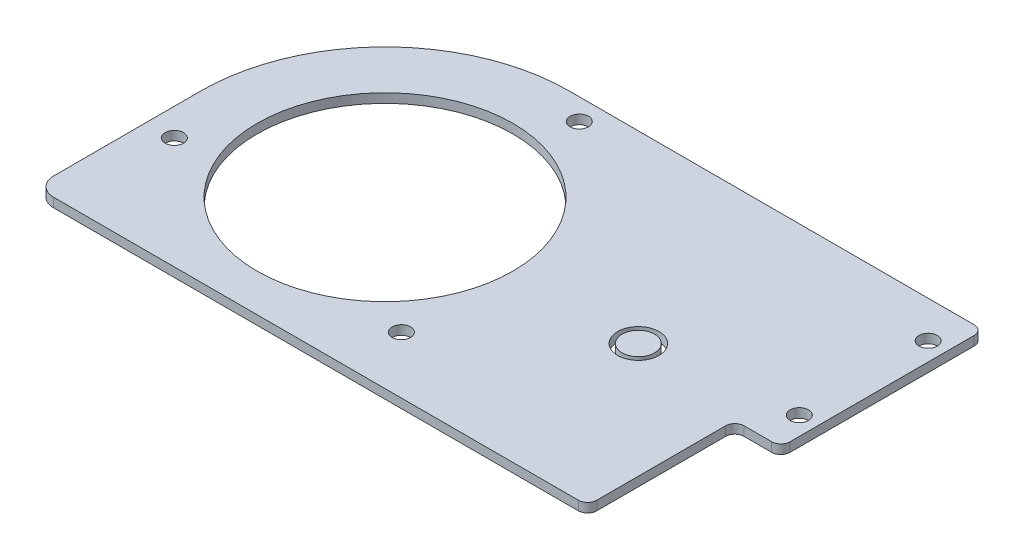
ISO-10303-21;
HEADER;
FILE_DESCRIPTION(('STEP AP214'),'2;1');
FILE_NAME('part.step','',(''),(''),'','','');
FILE_SCHEMA(('AUTOMOTIVE_DESIGN { 1 0 10303 214 1 1 1 1 }'));
ENDSEC;
DATA;
#1=APPLICATION_CONTEXT('core data for automotive mechanical design processes');
#2=APPLICATION_PROTOCOL_DEFINITION('international standard','automotive_design',2000,#1);
#3=PRODUCT_CONTEXT('',#1,'mechanical');
#4=PRODUCT('Part','Part','',(#3));
#5=PRODUCT_RELATED_PRODUCT_CATEGORY('part','',(#4));
#6=PRODUCT_DEFINITION_FORMATION('','',#4);
#7=PRODUCT_DEFINITION_CONTEXT('part definition',#1,'design');
#8=PRODUCT_DEFINITION('design','',#6,#7);
#9=PRODUCT_DEFINITION_SHAPE('','',#8);
#10=(LENGTH_UNIT() NAMED_UNIT(*) SI_UNIT(.MILLI.,.METRE.));
#11=(NAMED_UNIT(*) PLANE_ANGLE_UNIT() SI_UNIT($,.RADIAN.));
#12=(NAMED_UNIT(*) SI_UNIT($,.STERADIAN.) SOLID_ANGLE_UNIT());
#13=UNCERTAINTY_MEASURE_WITH_UNIT(LENGTH_MEASURE(1.E-05),#10,'distance_accuracy_value','');
#14=(GEOMETRIC_REPRESENTATION_CONTEXT(3) GLOBAL_UNCERTAINTY_ASSIGNED_CONTEXT((#13)) GLOBAL_UNIT_ASSIGNED_CONTEXT((#10,
#11,#12)) REPRESENTATION_CONTEXT('',''));
#15=CARTESIAN_POINT('',(0.,0.,0.));
#16=DIRECTION('',(0.,0.,1.));
#17=DIRECTION('',(1.,0.,0.));
#18=AXIS2_PLACEMENT_3D('',#15,#16,#17);
#19=CARTESIAN_POINT('',(-114.3,6.35,101.6));
#20=DIRECTION('',(0.,-1.,0.));
#21=DIRECTION('',(0.,0.,-1.));
#22=AXIS2_PLACEMENT_3D('',#19,#20,#21);
#23=PLANE('',#22);
#24=CARTESIAN_POINT('',(21.8094681715398,6.35,-112.199987068068));
#25=DIRECTION('',(0.,1.,0.));
#26=DIRECTION('',(0.,0.,1.));
#27=AXIS2_PLACEMENT_3D('',#24,#25,#26);
#28=CIRCLE('',#27,6.34999999999998);
#29=CARTESIAN_POINT('',(21.8094681715398,6.35,-105.849987068068));
#30=VERTEX_POINT('',#29);
#31=EDGE_CURVE('E195',#30,#30,#28,.T.);
#32=ORIENTED_EDGE('',*,*,#31,.F.);
#33=EDGE_LOOP('',(#32));
#34=FACE_BOUND('',#33,.T.);
#35=CARTESIAN_POINT('',(273.05,6.35,-101.6));
#36=DIRECTION('',(0.,1.,0.));
#37=DIRECTION('',(0.,0.,1.));
#38=AXIS2_PLACEMENT_3D('',#35,#36,#37);
#39=CIRCLE('',#38,6.35);
#40=CARTESIAN_POINT('',(273.05,6.35,-95.2500000000001));
#41=VERTEX_POINT('',#40);
#42=EDGE_CURVE('E183',#41,#41,#39,.T.);
#43=ORIENTED_EDGE('',*,*,#42,.F.);
#44=EDGE_LOOP('',(#43));
#45=FACE_BOUND('',#44,.T.);
#46=CARTESIAN_POINT('',(0.,6.35,0.));
#47=DIRECTION('',(0.,1.,0.));
#48=DIRECTION('',(0.,0.,1.));
#49=AXIS2_PLACEMENT_3D('',#46,#47,#48);
#50=CIRCLE('',#49,88.265);
#51=CARTESIAN_POINT('',(0.,6.35,88.265));
#52=VERTEX_POINT('',#51);
#53=EDGE_CURVE('E173',#52,#52,#50,.T.);
#54=ORIENTED_EDGE('',*,*,#53,.F.);
#55=EDGE_LOOP('',(#54));
#56=FACE_BOUND('',#55,.T.);
#57=CARTESIAN_POINT('',(-114.3,6.35,101.6));
#58=DIRECTION('',(0.,1.,0.));
#59=DIRECTION('',(0.,0.,-1.));
#60=AXIS2_PLACEMENT_3D('',#57,#58,#59);
#61=CIRCLE('',#60,12.7);
#62=CARTESIAN_POINT('',(-127.,6.35,101.6));
#63=VERTEX_POINT('',#62);
#64=CARTESIAN_POINT('',(-114.3,6.35,114.3));
#65=VERTEX_POINT('',#64);
#66=EDGE_CURVE('E143',#63,#65,#61,.T.);
#67=ORIENTED_EDGE('',*,*,#66,.T.);
#68=DIRECTION('',(1.,0.,0.));
#69=VECTOR('',#68,1.);
#70=CARTESIAN_POINT('',(247.65,6.35,114.3));
#71=LINE('',#70,#69);
#72=CARTESIAN_POINT('',(247.65,6.35,114.3));
#73=VERTEX_POINT('',#72);
#74=EDGE_CURVE('E136',#65,#73,#71,.T.);
#75=ORIENTED_EDGE('',*,*,#74,.T.);
#76=CARTESIAN_POINT('',(247.65,6.35,107.95));
#77=DIRECTION('',(0.,1.,0.));
#78=DIRECTION('',(0.,0.,1.));
#79=AXIS2_PLACEMENT_3D('',#76,#77,#78);
#80=CIRCLE('',#79,6.35000000000003);
#81=CARTESIAN_POINT('',(254.,6.35,107.95));
#82=VERTEX_POINT('',#81);
#83=EDGE_CURVE('E140',#73,#82,#80,.T.);
#84=ORIENTED_EDGE('',*,*,#83,.T.);
#85=DIRECTION('',(0.,0.,-1.));
#86=VECTOR('',#85,1.);
#87=CARTESIAN_POINT('',(254.,6.35,107.95));
#88=LINE('',#87,#86);
#89=CARTESIAN_POINT('',(254.,6.35,19.05));
#90=VERTEX_POINT('',#89);
#91=EDGE_CURVE('E161',#82,#90,#88,.T.);
#92=ORIENTED_EDGE('',*,*,#91,.T.);
#93=CARTESIAN_POINT('',(260.35,6.35,19.05));
#94=DIRECTION('',(0.,-1.,0.));
#95=DIRECTION('',(0.,0.,1.));
#96=AXIS2_PLACEMENT_3D('',#93,#94,#95);
#97=CIRCLE('',#96,6.35000000000001);
#98=CARTESIAN_POINT('',(260.35,6.35,12.7));
#99=VERTEX_POINT('',#98);
#100=EDGE_CURVE('E163',#90,#99,#97,.T.);
#101=ORIENTED_EDGE('',*,*,#100,.T.);
#102=DIRECTION('',(1.,0.,0.));
#103=VECTOR('',#102,1.);
#104=CARTESIAN_POINT('',(260.35,6.35,12.7));
#105=LINE('',#104,#103);
#106=CARTESIAN_POINT('',(279.4,6.35,12.7));
#107=VERTEX_POINT('',#106);
#108=EDGE_CURVE('E268',#99,#107,#105,.T.);
#109=ORIENTED_EDGE('',*,*,#108,.T.);
#110=CARTESIAN_POINT('',(279.4,6.35,6.35));
#111=DIRECTION('',(0.,1.,0.));
#112=DIRECTION('',(0.,0.,-1.));
#113=AXIS2_PLACEMENT_3D('',#110,#111,#112);
#114=CIRCLE('',#113,6.35000000000001);
#115=CARTESIAN_POINT('',(285.75,6.35,6.34999999999996));
#116=VERTEX_POINT('',#115);
#117=EDGE_CURVE('E266',#107,#116,#114,.T.);
#118=ORIENTED_EDGE('',*,*,#117,.T.);
#119=DIRECTION('',(0.,0.,-1.));
#120=VECTOR('',#119,1.);
#121=CARTESIAN_POINT('',(285.75,6.35,-120.65));
#122=LINE('',#121,#120);
#123=CARTESIAN_POINT('',(285.75,6.35,-120.65));
#124=VERTEX_POINT('',#123);
#125=EDGE_CURVE('E264',#116,#124,#122,.T.);
#126=ORIENTED_EDGE('',*,*,#125,.T.);
#127=CARTESIAN_POINT('',(279.4,6.35,-120.65));
#128=DIRECTION('',(0.,1.,0.));
#129=DIRECTION('',(0.,0.,-1.));
#130=AXIS2_PLACEMENT_3D('',#127,#128,#129);
#131=CIRCLE('',#130,6.35000000000001);
#132=CARTESIAN_POINT('',(279.4,6.35,-127.));
#133=VERTEX_POINT('',#132);
#134=EDGE_CURVE('E262',#124,#133,#131,.T.);
#135=ORIENTED_EDGE('',*,*,#134,.T.);
#136=DIRECTION('',(-1.,0.,0.));
#137=VECTOR('',#136,1.);
#138=CARTESIAN_POINT('',(279.4,6.35,-127.));
#139=LINE('',#138,#137);
#140=CARTESIAN_POINT('',(0.,6.35,-127.));
#141=VERTEX_POINT('',#140);
#142=EDGE_CURVE('E260',#133,#141,#139,.T.);
#143=ORIENTED_EDGE('',*,*,#142,.T.);
#144=CARTESIAN_POINT('',(0.,6.35,0.));
#145=DIRECTION('',(0.,1.,0.));
#146=DIRECTION('',(0.,0.,-1.));
#147=AXIS2_PLACEMENT_3D('',#144,#145,#146);
#148=CIRCLE('',#147,127.);
#149=CARTESIAN_POINT('',(-127.,6.35,0.));
#150=VERTEX_POINT('',#149);
#151=EDGE_CURVE('E258',#141,#150,#148,.T.);
#152=ORIENTED_EDGE('',*,*,#151,.T.);
#153=DIRECTION('',(0.,0.,1.));
#154=VECTOR('',#153,1.);
#155=CARTESIAN_POINT('',(-127.,6.35,0.));
#156=LINE('',#155,#154);
#157=EDGE_CURVE('E198',#150,#63,#156,.T.);
#158=ORIENTED_EDGE('',*,*,#157,.T.);
#159=EDGE_LOOP('',(#67,#75,#84,#92,#101,#109,#118,#126,#135,#143,#152,#158));
#160=FACE_BOUND('',#159,.T.);
#161=CARTESIAN_POINT('',(-108.072773191002,6.35,37.2124400544523));
#162=DIRECTION('',(0.,1.,0.));
#163=DIRECTION('',(0.,0.,1.));
#164=AXIS2_PLACEMENT_3D('',#161,#162,#163);
#165=CIRCLE('',#164,6.35);
#166=CARTESIAN_POINT('',(-108.072773191002,6.35,43.5624400544523));
#167=VERTEX_POINT('',#166);
#168=EDGE_CURVE('E176',#167,#167,#165,.T.);
#169=ORIENTED_EDGE('',*,*,#168,.F.);
#170=EDGE_LOOP('',(#169));
#171=FACE_BOUND('',#170,.T.);
#172=CARTESIAN_POINT('',(273.05,6.35,-12.7));
#173=DIRECTION('',(0.,1.,0.));
#174=DIRECTION('',(0.,0.,1.));
#175=AXIS2_PLACEMENT_3D('',#172,#173,#174);
#176=CIRCLE('',#175,6.35);
#177=CARTESIAN_POINT('',(273.05,6.35,-6.35));
#178=VERTEX_POINT('',#177);
#179=EDGE_CURVE('E189',#178,#178,#176,.T.);
#180=ORIENTED_EDGE('',*,*,#179,.F.);
#181=EDGE_LOOP('',(#180));
#182=FACE_BOUND('',#181,.T.);
#183=CARTESIAN_POINT('',(86.2633050194624,6.35,74.9875470136155));
#184=DIRECTION('',(0.,1.,0.));
#185=DIRECTION('',(0.,0.,1.));
#186=AXIS2_PLACEMENT_3D('',#183,#184,#185);
#187=CIRCLE('',#186,6.34999999999999);
#188=CARTESIAN_POINT('',(86.2633050194624,6.35,81.3375470136155));
#189=VERTEX_POINT('',#188);
#190=EDGE_CURVE('E59',#189,#189,#187,.T.);
#191=ORIENTED_EDGE('',*,*,#190,.F.);
#192=EDGE_LOOP('',(#191));
#193=FACE_BOUND('',#192,.T.);
#194=CARTESIAN_POINT('',(174.752,6.35,0.));
#195=DIRECTION('',(0.,-1.,0.));
#196=DIRECTION('',(0.,0.,-1.));
#197=AXIS2_PLACEMENT_3D('',#194,#195,#196);
#198=CIRCLE('',#197,14.2875);
#199=CARTESIAN_POINT('',(174.752,6.35,-14.2875));
#200=VERTEX_POINT('',#199);
#201=EDGE_CURVE('E12',#200,#200,#198,.F.);
#202=ORIENTED_EDGE('',*,*,#201,.F.);
#203=EDGE_LOOP('',(#202));
#204=FACE_BOUND('',#203,.T.);
#205=ADVANCED_FACE('F50',(#34,#45,#56,#160,#171,#182,#193,#204),#23,.F.);
#206=CARTESIAN_POINT('',(-114.3,0.,101.6));
#207=DIRECTION('',(0.,-1.,0.));
#208=DIRECTION('',(0.,0.,-1.));
#209=AXIS2_PLACEMENT_3D('',#206,#207,#208);
#210=PLANE('',#209);
#211=CARTESIAN_POINT('',(21.8094681715398,0.,-112.199987068068));
#212=DIRECTION('',(0.,1.,0.));
#213=DIRECTION('',(0.,0.,1.));
#214=AXIS2_PLACEMENT_3D('',#211,#212,#213);
#215=CIRCLE('',#214,6.34999999999998);
#216=CARTESIAN_POINT('',(21.8094681715398,0.,-105.849987068068));
#217=VERTEX_POINT('',#216);
#218=EDGE_CURVE('E186',#217,#217,#215,.T.);
#219=ORIENTED_EDGE('',*,*,#218,.T.);
#220=EDGE_LOOP('',(#219));
#221=FACE_BOUND('',#220,.T.);
#222=CARTESIAN_POINT('',(273.05,0.,-101.6));
#223=DIRECTION('',(0.,1.,0.));
#224=DIRECTION('',(0.,0.,1.));
#225=AXIS2_PLACEMENT_3D('',#222,#223,#224);
#226=CIRCLE('',#225,6.35);
#227=CARTESIAN_POINT('',(273.05,0.,-95.2500000000001));
#228=VERTEX_POINT('',#227);
#229=EDGE_CURVE('E172',#228,#228,#226,.T.);
#230=ORIENTED_EDGE('',*,*,#229,.T.);
#231=EDGE_LOOP('',(#230));
#232=FACE_BOUND('',#231,.T.);
#233=CARTESIAN_POINT('',(0.,0.,0.));
#234=DIRECTION('',(0.,1.,0.));
#235=DIRECTION('',(0.,0.,1.));
#236=AXIS2_PLACEMENT_3D('',#233,#234,#235);
#237=CIRCLE('',#236,88.265);
#238=CARTESIAN_POINT('',(0.,0.,88.265));
#239=VERTEX_POINT('',#238);
#240=EDGE_CURVE('E168',#239,#239,#237,.T.);
#241=ORIENTED_EDGE('',*,*,#240,.T.);
#242=EDGE_LOOP('',(#241));
#243=FACE_BOUND('',#242,.T.);
#244=CARTESIAN_POINT('',(-114.3,0.,101.6));
#245=DIRECTION('',(0.,1.,0.));
#246=DIRECTION('',(0.,0.,-1.));
#247=AXIS2_PLACEMENT_3D('',#244,#245,#246);
#248=CIRCLE('',#247,12.7);
#249=CARTESIAN_POINT('',(-127.,0.,101.6));
#250=VERTEX_POINT('',#249);
#251=CARTESIAN_POINT('',(-114.3,0.,114.3));
#252=VERTEX_POINT('',#251);
#253=EDGE_CURVE('E243',#250,#252,#248,.T.);
#254=ORIENTED_EDGE('',*,*,#253,.F.);
#255=DIRECTION('',(0.,0.,1.));
#256=VECTOR('',#255,1.);
#257=CARTESIAN_POINT('',(-127.,0.,0.));
#258=LINE('',#257,#256);
#259=CARTESIAN_POINT('',(-127.,0.,0.));
#260=VERTEX_POINT('',#259);
#261=EDGE_CURVE('E67',#260,#250,#258,.T.);
#262=ORIENTED_EDGE('',*,*,#261,.F.);
#263=CARTESIAN_POINT('',(0.,0.,0.));
#264=DIRECTION('',(0.,1.,0.));
#265=DIRECTION('',(0.,0.,-1.));
#266=AXIS2_PLACEMENT_3D('',#263,#264,#265);
#267=CIRCLE('',#266,127.);
#268=CARTESIAN_POINT('',(0.,0.,-127.));
#269=VERTEX_POINT('',#268);
#270=EDGE_CURVE('E318',#269,#260,#267,.T.);
#271=ORIENTED_EDGE('',*,*,#270,.F.);
#272=DIRECTION('',(-1.,0.,0.));
#273=VECTOR('',#272,1.);
#274=CARTESIAN_POINT('',(279.4,0.,-127.));
#275=LINE('',#274,#273);
#276=CARTESIAN_POINT('',(279.4,0.,-127.));
#277=VERTEX_POINT('',#276);
#278=EDGE_CURVE('E309',#277,#269,#275,.T.);
#279=ORIENTED_EDGE('',*,*,#278,.F.);
#280=CARTESIAN_POINT('',(279.4,0.,-120.65));
#281=DIRECTION('',(0.,1.,0.));
#282=DIRECTION('',(0.,0.,-1.));
#283=AXIS2_PLACEMENT_3D('',#280,#281,#282);
#284=CIRCLE('',#283,6.35000000000001);
#285=CARTESIAN_POINT('',(285.75,0.,-120.65));
#286=VERTEX_POINT('',#285);
#287=EDGE_CURVE('E310',#286,#277,#284,.T.);
#288=ORIENTED_EDGE('',*,*,#287,.F.);
#289=DIRECTION('',(0.,0.,-1.));
#290=VECTOR('',#289,1.);
#291=CARTESIAN_POINT('',(285.75,0.,-120.65));
#292=LINE('',#291,#290);
#293=CARTESIAN_POINT('',(285.75,0.,6.34999999999996));
#294=VERTEX_POINT('',#293);
#295=EDGE_CURVE('E292',#294,#286,#292,.T.);
#296=ORIENTED_EDGE('',*,*,#295,.F.);
#297=CARTESIAN_POINT('',(279.4,0.,6.35));
#298=DIRECTION('',(0.,1.,0.));
#299=DIRECTION('',(0.,0.,-1.));
#300=AXIS2_PLACEMENT_3D('',#297,#298,#299);
#301=CIRCLE('',#300,6.35000000000001);
#302=CARTESIAN_POINT('',(279.4,0.,12.7));
#303=VERTEX_POINT('',#302);
#304=EDGE_CURVE('E283',#303,#294,#301,.T.);
#305=ORIENTED_EDGE('',*,*,#304,.F.);
#306=DIRECTION('',(1.,0.,0.));
#307=VECTOR('',#306,1.);
#308=CARTESIAN_POINT('',(260.35,0.,12.7));
#309=LINE('',#308,#307);
#310=CARTESIAN_POINT('',(260.35,0.,12.7));
#311=VERTEX_POINT('',#310);
#312=EDGE_CURVE('E284',#311,#303,#309,.T.);
#313=ORIENTED_EDGE('',*,*,#312,.F.);
#314=CARTESIAN_POINT('',(260.35,0.,19.05));
#315=DIRECTION('',(0.,-1.,0.));
#316=DIRECTION('',(0.,0.,1.));
#317=AXIS2_PLACEMENT_3D('',#314,#315,#316);
#318=CIRCLE('',#317,6.35000000000001);
#319=CARTESIAN_POINT('',(254.,0.,19.05));
#320=VERTEX_POINT('',#319);
#321=EDGE_CURVE('E280',#320,#311,#318,.T.);
#322=ORIENTED_EDGE('',*,*,#321,.F.);
#323=DIRECTION('',(0.,0.,-1.));
#324=VECTOR('',#323,1.);
#325=CARTESIAN_POINT('',(254.,0.,107.95));
#326=LINE('',#325,#324);
#327=CARTESIAN_POINT('',(254.,0.,107.95));
#328=VERTEX_POINT('',#327);
#329=EDGE_CURVE('E154',#328,#320,#326,.T.);
#330=ORIENTED_EDGE('',*,*,#329,.F.);
#331=CARTESIAN_POINT('',(247.65,0.,107.95));
#332=DIRECTION('',(0.,1.,0.));
#333=DIRECTION('',(0.,0.,1.));
#334=AXIS2_PLACEMENT_3D('',#331,#332,#333);
#335=CIRCLE('',#334,6.35000000000003);
#336=CARTESIAN_POINT('',(247.65,0.,114.3));
#337=VERTEX_POINT('',#336);
#338=EDGE_CURVE('E155',#337,#328,#335,.T.);
#339=ORIENTED_EDGE('',*,*,#338,.F.);
#340=DIRECTION('',(1.,0.,0.));
#341=VECTOR('',#340,1.);
#342=CARTESIAN_POINT('',(247.65,0.,114.3));
#343=LINE('',#342,#341);
#344=EDGE_CURVE('E151',#252,#337,#343,.T.);
#345=ORIENTED_EDGE('',*,*,#344,.F.);
#346=EDGE_LOOP('',(#254,#262,#271,#279,#288,#296,#305,#313,#322,#330,#339,#345));
#347=FACE_BOUND('',#346,.T.);
#348=CARTESIAN_POINT('',(-108.072773191002,0.,37.2124400544523));
#349=DIRECTION('',(0.,1.,0.));
#350=DIRECTION('',(0.,0.,1.));
#351=AXIS2_PLACEMENT_3D('',#348,#349,#350);
#352=CIRCLE('',#351,6.35);
#353=CARTESIAN_POINT('',(-108.072773191002,0.,43.5624400544523));
#354=VERTEX_POINT('',#353);
#355=EDGE_CURVE('E171',#354,#354,#352,.T.);
#356=ORIENTED_EDGE('',*,*,#355,.T.);
#357=EDGE_LOOP('',(#356));
#358=FACE_BOUND('',#357,.T.);
#359=CARTESIAN_POINT('',(273.05,0.,-12.7));
#360=DIRECTION('',(0.,1.,0.));
#361=DIRECTION('',(0.,0.,1.));
#362=AXIS2_PLACEMENT_3D('',#359,#360,#361);
#363=CIRCLE('',#362,6.35);
#364=CARTESIAN_POINT('',(273.05,0.,-6.35));
#365=VERTEX_POINT('',#364);
#366=EDGE_CURVE('E180',#365,#365,#363,.T.);
#367=ORIENTED_EDGE('',*,*,#366,.T.);
#368=EDGE_LOOP('',(#367));
#369=FACE_BOUND('',#368,.T.);
#370=CARTESIAN_POINT('',(86.2633050194624,0.,74.9875470136155));
#371=DIRECTION('',(0.,1.,0.));
#372=DIRECTION('',(0.,0.,1.));
#373=AXIS2_PLACEMENT_3D('',#370,#371,#372);
#374=CIRCLE('',#373,6.34999999999999);
#375=CARTESIAN_POINT('',(86.2633050194624,0.,81.3375470136155));
#376=VERTEX_POINT('',#375);
#377=EDGE_CURVE('E192',#376,#376,#374,.T.);
#378=ORIENTED_EDGE('',*,*,#377,.T.);
#379=EDGE_LOOP('',(#378));
#380=FACE_BOUND('',#379,.T.);
#381=CARTESIAN_POINT('',(174.752,0.,0.));
#382=DIRECTION('',(0.,1.,0.));
#383=DIRECTION('',(0.,0.,1.));
#384=AXIS2_PLACEMENT_3D('',#381,#382,#383);
#385=CIRCLE('',#384,14.2875);
#386=CARTESIAN_POINT('',(174.752,0.,14.2875));
#387=VERTEX_POINT('',#386);
#388=EDGE_CURVE('E53',#387,#387,#385,.T.);
#389=ORIENTED_EDGE('',*,*,#388,.T.);
#390=EDGE_LOOP('',(#389));
#391=FACE_BOUND('',#390,.T.);
#392=ADVANCED_FACE('F211',(#221,#232,#243,#347,#358,#369,#380,#391),#210,.T.);
#393=CARTESIAN_POINT('',(-114.3,6.35,101.6));
#394=DIRECTION('',(0.,-1.,0.));
#395=DIRECTION('',(0.,0.,-1.));
#396=AXIS2_PLACEMENT_3D('',#393,#394,#395);
#397=CYLINDRICAL_SURFACE('',#396,12.7);
#398=ORIENTED_EDGE('',*,*,#253,.T.);
#399=DIRECTION('',(0.,-1.,0.));
#400=VECTOR('',#399,1.);
#401=CARTESIAN_POINT('',(-114.3,6.35,114.3));
#402=LINE('',#401,#400);
#403=EDGE_CURVE('E332',#65,#252,#402,.T.);
#404=ORIENTED_EDGE('',*,*,#403,.F.);
#405=ORIENTED_EDGE('',*,*,#66,.F.);
#406=DIRECTION('',(0.,-1.,0.));
#407=VECTOR('',#406,1.);
#408=CARTESIAN_POINT('',(-127.,6.35,101.6));
#409=LINE('',#408,#407);
#410=EDGE_CURVE('E251',#63,#250,#409,.T.);
#411=ORIENTED_EDGE('',*,*,#410,.T.);
#412=EDGE_LOOP('',(#398,#404,#405,#411));
#413=FACE_BOUND('',#412,.T.);
#414=ADVANCED_FACE('F227',(#413),#397,.T.);
#415=CARTESIAN_POINT('',(247.65,6.35,114.3));
#416=DIRECTION('',(0.,0.,-1.));
#417=DIRECTION('',(-1.,0.,0.));
#418=AXIS2_PLACEMENT_3D('',#415,#416,#417);
#419=PLANE('',#418);
#420=ORIENTED_EDGE('',*,*,#344,.T.);
#421=DIRECTION('',(0.,-1.,0.));
#422=VECTOR('',#421,1.);
#423=CARTESIAN_POINT('',(247.65,6.35,114.3));
#424=LINE('',#423,#422);
#425=EDGE_CURVE('E149',#73,#337,#424,.T.);
#426=ORIENTED_EDGE('',*,*,#425,.F.);
#427=ORIENTED_EDGE('',*,*,#74,.F.);
#428=ORIENTED_EDGE('',*,*,#403,.T.);
#429=EDGE_LOOP('',(#420,#426,#427,#428));
#430=FACE_BOUND('',#429,.T.);
#431=ADVANCED_FACE('F150',(#430),#419,.F.);
#432=CARTESIAN_POINT('',(247.65,6.35,107.95));
#433=DIRECTION('',(0.,-1.,0.));
#434=DIRECTION('',(0.,0.,-1.));
#435=AXIS2_PLACEMENT_3D('',#432,#433,#434);
#436=CYLINDRICAL_SURFACE('',#435,6.35000000000003);
#437=ORIENTED_EDGE('',*,*,#338,.T.);
#438=DIRECTION('',(0.,-1.,0.));
#439=VECTOR('',#438,1.);
#440=CARTESIAN_POINT('',(254.,6.35,107.95));
#441=LINE('',#440,#439);
#442=EDGE_CURVE('E159',#82,#328,#441,.T.);
#443=ORIENTED_EDGE('',*,*,#442,.F.);
#444=ORIENTED_EDGE('',*,*,#83,.F.);
#445=ORIENTED_EDGE('',*,*,#425,.T.);
#446=EDGE_LOOP('',(#437,#443,#444,#445));
#447=FACE_BOUND('',#446,.T.);
#448=ADVANCED_FACE('F157',(#447),#436,.T.);
#449=CARTESIAN_POINT('',(254.,6.35,107.95));
#450=DIRECTION('',(-1.,0.,0.));
#451=DIRECTION('',(0.,0.,1.));
#452=AXIS2_PLACEMENT_3D('',#449,#450,#451);
#453=PLANE('',#452);
#454=ORIENTED_EDGE('',*,*,#329,.T.);
#455=DIRECTION('',(0.,-1.,0.));
#456=VECTOR('',#455,1.);
#457=CARTESIAN_POINT('',(254.,6.35,19.05));
#458=LINE('',#457,#456);
#459=EDGE_CURVE('E336',#90,#320,#458,.T.);
#460=ORIENTED_EDGE('',*,*,#459,.F.);
#461=ORIENTED_EDGE('',*,*,#91,.F.);
#462=ORIENTED_EDGE('',*,*,#442,.T.);
#463=EDGE_LOOP('',(#454,#460,#461,#462));
#464=FACE_BOUND('',#463,.T.);
#465=ADVANCED_FACE('F350',(#464),#453,.F.);
#466=CARTESIAN_POINT('',(260.35,6.35,19.05));
#467=DIRECTION('',(0.,-1.,0.));
#468=DIRECTION('',(0.,0.,-1.));
#469=AXIS2_PLACEMENT_3D('',#466,#467,#468);
#470=CYLINDRICAL_SURFACE('',#469,6.35000000000001);
#471=ORIENTED_EDGE('',*,*,#321,.T.);
#472=DIRECTION('',(0.,-1.,0.));
#473=VECTOR('',#472,1.);
#474=CARTESIAN_POINT('',(260.35,6.35,12.7));
#475=LINE('',#474,#473);
#476=EDGE_CURVE('E277',#99,#311,#475,.T.);
#477=ORIENTED_EDGE('',*,*,#476,.F.);
#478=ORIENTED_EDGE('',*,*,#100,.F.);
#479=ORIENTED_EDGE('',*,*,#459,.T.);
#480=EDGE_LOOP('',(#471,#477,#478,#479));
#481=FACE_BOUND('',#480,.T.);
#482=ADVANCED_FACE('F278',(#481),#470,.F.);
#483=CARTESIAN_POINT('',(260.35,6.35,12.7));
#484=DIRECTION('',(0.,0.,-1.));
#485=DIRECTION('',(-1.,0.,0.));
#486=AXIS2_PLACEMENT_3D('',#483,#484,#485);
#487=PLANE('',#486);
#488=ORIENTED_EDGE('',*,*,#312,.T.);
#489=DIRECTION('',(0.,-1.,0.));
#490=VECTOR('',#489,1.);
#491=CARTESIAN_POINT('',(279.4,6.35,12.7));
#492=LINE('',#491,#490);
#493=EDGE_CURVE('E288',#107,#303,#492,.T.);
#494=ORIENTED_EDGE('',*,*,#493,.F.);
#495=ORIENTED_EDGE('',*,*,#108,.F.);
#496=ORIENTED_EDGE('',*,*,#476,.T.);
#497=EDGE_LOOP('',(#488,#494,#495,#496));
#498=FACE_BOUND('',#497,.T.);
#499=ADVANCED_FACE('F286',(#498),#487,.F.);
#500=CARTESIAN_POINT('',(279.4,6.35,6.35));
#501=DIRECTION('',(0.,-1.,0.));
#502=DIRECTION('',(0.,0.,-1.));
#503=AXIS2_PLACEMENT_3D('',#500,#501,#502);
#504=CYLINDRICAL_SURFACE('',#503,6.35000000000001);
#505=ORIENTED_EDGE('',*,*,#304,.T.);
#506=DIRECTION('',(0.,-1.,0.));
#507=VECTOR('',#506,1.);
#508=CARTESIAN_POINT('',(285.75,6.35,6.34999999999996));
#509=LINE('',#508,#507);
#510=EDGE_CURVE('E297',#116,#294,#509,.T.);
#511=ORIENTED_EDGE('',*,*,#510,.F.);
#512=ORIENTED_EDGE('',*,*,#117,.F.);
#513=ORIENTED_EDGE('',*,*,#493,.T.);
#514=EDGE_LOOP('',(#505,#511,#512,#513));
#515=FACE_BOUND('',#514,.T.);
#516=ADVANCED_FACE('F295',(#515),#504,.T.);
#517=CARTESIAN_POINT('',(285.75,6.35,-120.65));
#518=DIRECTION('',(-1.,0.,0.));
#519=DIRECTION('',(0.,0.,1.));
#520=AXIS2_PLACEMENT_3D('',#517,#518,#519);
#521=PLANE('',#520);
#522=ORIENTED_EDGE('',*,*,#295,.T.);
#523=DIRECTION('',(0.,-1.,0.));
#524=VECTOR('',#523,1.);
#525=CARTESIAN_POINT('',(285.75,6.35,-120.65));
#526=LINE('',#525,#524);
#527=EDGE_CURVE('E304',#124,#286,#526,.T.);
#528=ORIENTED_EDGE('',*,*,#527,.F.);
#529=ORIENTED_EDGE('',*,*,#125,.F.);
#530=ORIENTED_EDGE('',*,*,#510,.T.);
#531=EDGE_LOOP('',(#522,#528,#529,#530));
#532=FACE_BOUND('',#531,.T.);
#533=ADVANCED_FACE('F305',(#532),#521,.F.);
#534=CARTESIAN_POINT('',(279.4,6.35,-120.65));
#535=DIRECTION('',(0.,-1.,0.));
#536=DIRECTION('',(0.,0.,-1.));
#537=AXIS2_PLACEMENT_3D('',#534,#535,#536);
#538=CYLINDRICAL_SURFACE('',#537,6.35000000000001);
#539=ORIENTED_EDGE('',*,*,#287,.T.);
#540=DIRECTION('',(0.,-1.,0.));
#541=VECTOR('',#540,1.);
#542=CARTESIAN_POINT('',(279.4,6.35,-127.));
#543=LINE('',#542,#541);
#544=EDGE_CURVE('E314',#133,#277,#543,.T.);
#545=ORIENTED_EDGE('',*,*,#544,.F.);
#546=ORIENTED_EDGE('',*,*,#134,.F.);
#547=ORIENTED_EDGE('',*,*,#527,.T.);
#548=EDGE_LOOP('',(#539,#545,#546,#547));
#549=FACE_BOUND('',#548,.T.);
#550=ADVANCED_FACE('F312',(#549),#538,.T.);
#551=CARTESIAN_POINT('',(279.4,6.35,-127.));
#552=DIRECTION('',(0.,0.,1.));
#553=DIRECTION('',(1.,0.,0.));
#554=AXIS2_PLACEMENT_3D('',#551,#552,#553);
#555=PLANE('',#554);
#556=ORIENTED_EDGE('',*,*,#278,.T.);
#557=DIRECTION('',(0.,-1.,0.));
#558=VECTOR('',#557,1.);
#559=CARTESIAN_POINT('',(0.,6.35,-127.));
#560=LINE('',#559,#558);
#561=EDGE_CURVE('E323',#141,#269,#560,.T.);
#562=ORIENTED_EDGE('',*,*,#561,.F.);
#563=ORIENTED_EDGE('',*,*,#142,.F.);
#564=ORIENTED_EDGE('',*,*,#544,.T.);
#565=EDGE_LOOP('',(#556,#562,#563,#564));
#566=FACE_BOUND('',#565,.T.);
#567=ADVANCED_FACE('F321',(#566),#555,.F.);
#568=CARTESIAN_POINT('',(0.,6.35,0.));
#569=DIRECTION('',(0.,-1.,0.));
#570=DIRECTION('',(0.,0.,-1.));
#571=AXIS2_PLACEMENT_3D('',#568,#569,#570);
#572=CYLINDRICAL_SURFACE('',#571,127.);
#573=ORIENTED_EDGE('',*,*,#270,.T.);
#574=DIRECTION('',(0.,-1.,0.));
#575=VECTOR('',#574,1.);
#576=CARTESIAN_POINT('',(-127.,6.35,0.));
#577=LINE('',#576,#575);
#578=EDGE_CURVE('E177',#150,#260,#577,.T.);
#579=ORIENTED_EDGE('',*,*,#578,.F.);
#580=ORIENTED_EDGE('',*,*,#151,.F.);
#581=ORIENTED_EDGE('',*,*,#561,.T.);
#582=EDGE_LOOP('',(#573,#579,#580,#581));
#583=FACE_BOUND('',#582,.T.);
#584=ADVANCED_FACE('F328',(#583),#572,.T.);
#585=CARTESIAN_POINT('',(-127.,6.35,0.));
#586=DIRECTION('',(1.,0.,0.));
#587=DIRECTION('',(0.,0.,-1.));
#588=AXIS2_PLACEMENT_3D('',#585,#586,#587);
#589=PLANE('',#588);
#590=ORIENTED_EDGE('',*,*,#261,.T.);
#591=ORIENTED_EDGE('',*,*,#410,.F.);
#592=ORIENTED_EDGE('',*,*,#157,.F.);
#593=ORIENTED_EDGE('',*,*,#578,.T.);
#594=EDGE_LOOP('',(#590,#591,#592,#593));
#595=FACE_BOUND('',#594,.T.);
#596=ADVANCED_FACE('F331',(#595),#589,.F.);
#597=CARTESIAN_POINT('',(0.,6.35,0.));
#598=DIRECTION('',(0.,-1.,0.));
#599=DIRECTION('',(0.,0.,-1.));
#600=AXIS2_PLACEMENT_3D('',#597,#598,#599);
#601=CYLINDRICAL_SURFACE('',#600,88.265);
#602=ORIENTED_EDGE('',*,*,#53,.T.);
#603=EDGE_LOOP('',(#602));
#604=FACE_BOUND('',#603,.T.);
#605=ORIENTED_EDGE('',*,*,#240,.F.);
#606=EDGE_LOOP('',(#605));
#607=FACE_BOUND('',#606,.T.);
#608=ADVANCED_FACE('F375',(#604,#607),#601,.F.);
#609=CARTESIAN_POINT('',(-108.072773191002,6.35,37.2124400544523));
#610=DIRECTION('',(0.,-1.,0.));
#611=DIRECTION('',(0.,0.,-1.));
#612=AXIS2_PLACEMENT_3D('',#609,#610,#611);
#613=CYLINDRICAL_SURFACE('',#612,6.35);
#614=ORIENTED_EDGE('',*,*,#168,.T.);
#615=EDGE_LOOP('',(#614));
#616=FACE_BOUND('',#615,.T.);
#617=ORIENTED_EDGE('',*,*,#355,.F.);
#618=EDGE_LOOP('',(#617));
#619=FACE_BOUND('',#618,.T.);
#620=ADVANCED_FACE('F378',(#616,#619),#613,.F.);
#621=CARTESIAN_POINT('',(273.05,6.35,-101.6));
#622=DIRECTION('',(0.,-1.,0.));
#623=DIRECTION('',(0.,0.,-1.));
#624=AXIS2_PLACEMENT_3D('',#621,#622,#623);
#625=CYLINDRICAL_SURFACE('',#624,6.35);
#626=ORIENTED_EDGE('',*,*,#42,.T.);
#627=EDGE_LOOP('',(#626));
#628=FACE_BOUND('',#627,.T.);
#629=ORIENTED_EDGE('',*,*,#229,.F.);
#630=EDGE_LOOP('',(#629));
#631=FACE_BOUND('',#630,.T.);
#632=ADVANCED_FACE('F382',(#628,#631),#625,.F.);
#633=CARTESIAN_POINT('',(273.05,6.35,-12.7));
#634=DIRECTION('',(0.,-1.,0.));
#635=DIRECTION('',(0.,0.,-1.));
#636=AXIS2_PLACEMENT_3D('',#633,#634,#635);
#637=CYLINDRICAL_SURFACE('',#636,6.35);
#638=ORIENTED_EDGE('',*,*,#179,.T.);
#639=EDGE_LOOP('',(#638));
#640=FACE_BOUND('',#639,.T.);
#641=ORIENTED_EDGE('',*,*,#366,.F.);
#642=EDGE_LOOP('',(#641));
#643=FACE_BOUND('',#642,.T.);
#644=ADVANCED_FACE('F386',(#640,#643),#637,.F.);
#645=CARTESIAN_POINT('',(21.8094681715398,6.35,-112.199987068068));
#646=DIRECTION('',(0.,-1.,0.));
#647=DIRECTION('',(0.,0.,-1.));
#648=AXIS2_PLACEMENT_3D('',#645,#646,#647);
#649=CYLINDRICAL_SURFACE('',#648,6.34999999999998);
#650=ORIENTED_EDGE('',*,*,#31,.T.);
#651=EDGE_LOOP('',(#650));
#652=FACE_BOUND('',#651,.T.);
#653=ORIENTED_EDGE('',*,*,#218,.F.);
#654=EDGE_LOOP('',(#653));
#655=FACE_BOUND('',#654,.T.);
#656=ADVANCED_FACE('F222',(#652,#655),#649,.F.);
#657=CARTESIAN_POINT('',(86.2633050194624,6.35,74.9875470136155));
#658=DIRECTION('',(0.,-1.,0.));
#659=DIRECTION('',(0.,0.,-1.));
#660=AXIS2_PLACEMENT_3D('',#657,#658,#659);
#661=CYLINDRICAL_SURFACE('',#660,6.34999999999999);
#662=ORIENTED_EDGE('',*,*,#190,.T.);
#663=EDGE_LOOP('',(#662));
#664=FACE_BOUND('',#663,.T.);
#665=ORIENTED_EDGE('',*,*,#377,.F.);
#666=EDGE_LOOP('',(#665));
#667=FACE_BOUND('',#666,.T.);
#668=ADVANCED_FACE('F206',(#664,#667),#661,.F.);
#669=CARTESIAN_POINT('',(174.752,28.448,0.));
#670=DIRECTION('',(0.,-1.,0.));
#671=DIRECTION('',(0.,0.,-1.));
#672=AXIS2_PLACEMENT_3D('',#669,#670,#671);
#673=CYLINDRICAL_SURFACE('',#672,14.2875);
#674=ORIENTED_EDGE('',*,*,#388,.F.);
#675=EDGE_LOOP('',(#674));
#676=FACE_BOUND('',#675,.T.);
#677=ORIENTED_EDGE('',*,*,#201,.T.);
#678=EDGE_LOOP('',(#677));
#679=FACE_BOUND('',#678,.T.);
#680=ADVANCED_FACE('F215',(#676,#679),#673,.F.);
#681=CLOSED_SHELL('',(#205,#392,#414,#431,#448,#465,#482,#499,#516,#533,#550,#567,#584,#596,
#608,#620,#632,#644,#656,#668,#680));
#682=MANIFOLD_SOLID_BREP('B2',#681);
#683=CARTESIAN_POINT('',(-114.3,0.,101.6));
#684=DIRECTION('',(0.,-1.,0.));
#685=DIRECTION('',(0.,0.,-1.));
#686=AXIS2_PLACEMENT_3D('',#683,#684,#685);
#687=PLANE('',#686);
#688=CARTESIAN_POINT('',(174.752,0.,0.));
#689=DIRECTION('',(0.,1.,0.));
#690=DIRECTION('',(0.,0.,1.));
#691=AXIS2_PLACEMENT_3D('',#688,#689,#690);
#692=CIRCLE('',#691,11.176);
#693=CARTESIAN_POINT('',(174.752,0.,11.1760000000001));
#694=VERTEX_POINT('',#693);
#695=EDGE_CURVE('E549',#694,#694,#692,.T.);
#696=ORIENTED_EDGE('',*,*,#695,.F.);
#697=EDGE_LOOP('',(#696));
#698=FACE_BOUND('',#697,.T.);
#699=ADVANCED_FACE('F543',(#698),#687,.T.);
#700=CARTESIAN_POINT('',(174.752,28.448,0.));
#701=DIRECTION('',(0.,-1.,0.));
#702=DIRECTION('',(0.,0.,-1.));
#703=AXIS2_PLACEMENT_3D('',#700,#701,#702);
#704=CYLINDRICAL_SURFACE('',#703,11.176);
#705=ORIENTED_EDGE('',*,*,#695,.T.);
#706=EDGE_LOOP('',(#705));
#707=FACE_BOUND('',#706,.T.);
#708=CARTESIAN_POINT('',(174.752,6.35,0.));
#709=DIRECTION('',(0.,-1.,0.));
#710=DIRECTION('',(0.,0.,-1.));
#711=AXIS2_PLACEMENT_3D('',#708,#709,#710);
#712=CIRCLE('',#711,11.176);
#713=CARTESIAN_POINT('',(174.752,6.35,-11.176));
#714=VERTEX_POINT('',#713);
#715=EDGE_CURVE('E49',#714,#714,#712,.F.);
#716=ORIENTED_EDGE('',*,*,#715,.F.);
#717=EDGE_LOOP('',(#716));
#718=FACE_BOUND('',#717,.T.);
#719=ADVANCED_FACE('F555',(#707,#718),#704,.T.);
#720=CARTESIAN_POINT('',(-114.3,6.35,101.6));
#721=DIRECTION('',(0.,-1.,0.));
#722=DIRECTION('',(0.,0.,-1.));
#723=AXIS2_PLACEMENT_3D('',#720,#721,#722);
#724=PLANE('',#723);
#725=ORIENTED_EDGE('',*,*,#715,.T.);
#726=EDGE_LOOP('',(#725));
#727=FACE_BOUND('',#726,.T.);
#728=ADVANCED_FACE('F562',(#727),#724,.F.);
#729=CLOSED_SHELL('',(#699,#719,#728));
#730=MANIFOLD_SOLID_BREP('B6',#729);
#731=ADVANCED_BREP_SHAPE_REPRESENTATION('',(#18,#682,#730),#14);
#732=SHAPE_DEFINITION_REPRESENTATION(#9,#731);
ENDSEC;
END-ISO-10303-21;
